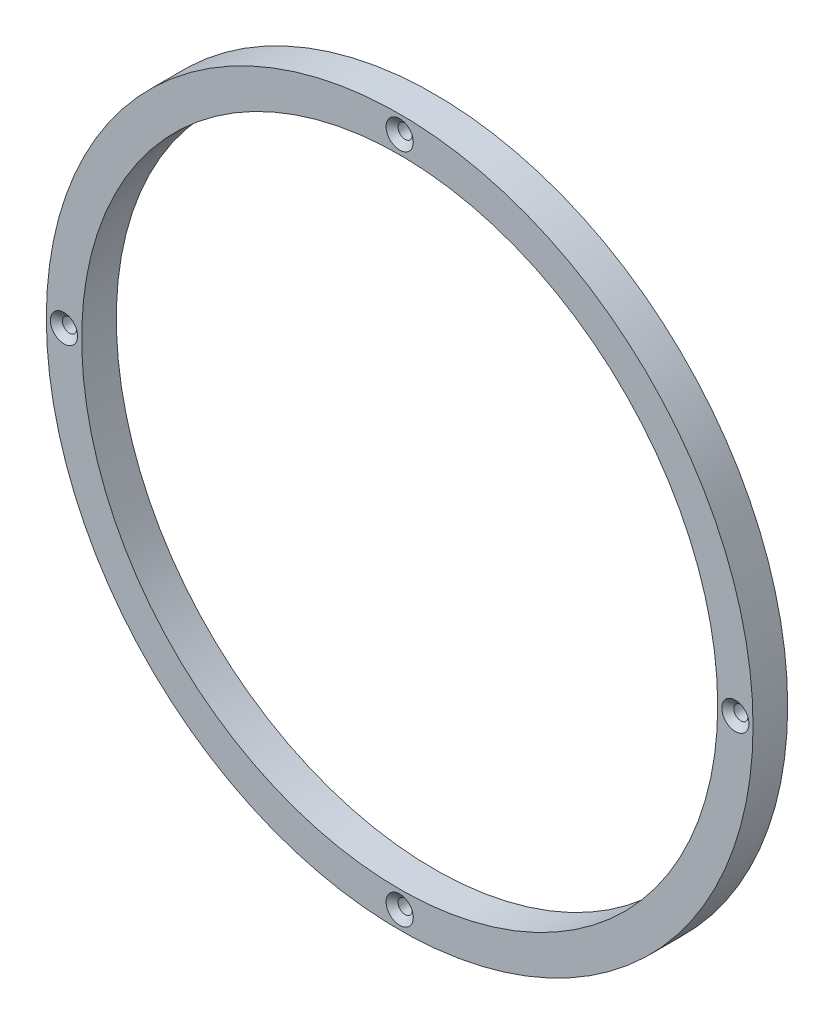
ISO-10303-21;
HEADER;
FILE_DESCRIPTION(('STEP AP214'),'2;1');
FILE_NAME('part.step','',(''),(''),'','','');
FILE_SCHEMA(('AUTOMOTIVE_DESIGN { 1 0 10303 214 1 1 1 1 }'));
ENDSEC;
DATA;
#1=APPLICATION_CONTEXT('core data for automotive mechanical design processes');
#2=APPLICATION_PROTOCOL_DEFINITION('international standard','automotive_design',2000,#1);
#3=PRODUCT_CONTEXT('',#1,'mechanical');
#4=PRODUCT('Part','Part','',(#3));
#5=PRODUCT_RELATED_PRODUCT_CATEGORY('part','',(#4));
#6=PRODUCT_DEFINITION_FORMATION('','',#4);
#7=PRODUCT_DEFINITION_CONTEXT('part definition',#1,'design');
#8=PRODUCT_DEFINITION('design','',#6,#7);
#9=PRODUCT_DEFINITION_SHAPE('','',#8);
#10=(LENGTH_UNIT() NAMED_UNIT(*) SI_UNIT(.MILLI.,.METRE.));
#11=(NAMED_UNIT(*) PLANE_ANGLE_UNIT() SI_UNIT($,.RADIAN.));
#12=(NAMED_UNIT(*) SI_UNIT($,.STERADIAN.) SOLID_ANGLE_UNIT());
#13=UNCERTAINTY_MEASURE_WITH_UNIT(LENGTH_MEASURE(1.E-05),#10,'distance_accuracy_value','');
#14=(GEOMETRIC_REPRESENTATION_CONTEXT(3) GLOBAL_UNCERTAINTY_ASSIGNED_CONTEXT((#13)) GLOBAL_UNIT_ASSIGNED_CONTEXT((#10,
#11,#12)) REPRESENTATION_CONTEXT('',''));
#15=CARTESIAN_POINT('',(0.,0.,0.));
#16=DIRECTION('',(0.,0.,1.));
#17=DIRECTION('',(1.,0.,0.));
#18=AXIS2_PLACEMENT_3D('',#15,#16,#17);
#19=CARTESIAN_POINT('',(0.,0.,12.446));
#20=DIRECTION('',(0.,0.,-1.));
#21=DIRECTION('',(-1.,0.,0.));
#22=AXIS2_PLACEMENT_3D('',#19,#20,#21);
#23=CYLINDRICAL_SURFACE('',#22,114.3);
#24=CARTESIAN_POINT('',(0.,0.,12.446));
#25=DIRECTION('',(0.,0.,1.));
#26=DIRECTION('',(1.,0.,0.));
#27=AXIS2_PLACEMENT_3D('',#24,#25,#26);
#28=CIRCLE('',#27,114.3);
#29=CARTESIAN_POINT('',(114.3,0.,12.446));
#30=VERTEX_POINT('',#29);
#31=EDGE_CURVE('E45',#30,#30,#28,.T.);
#32=ORIENTED_EDGE('',*,*,#31,.T.);
#33=EDGE_LOOP('',(#32));
#34=FACE_BOUND('',#33,.T.);
#35=CARTESIAN_POINT('',(0.,0.,0.));
#36=DIRECTION('',(0.,0.,1.));
#37=DIRECTION('',(1.,0.,0.));
#38=AXIS2_PLACEMENT_3D('',#35,#36,#37);
#39=CIRCLE('',#38,114.3);
#40=CARTESIAN_POINT('',(114.3,0.,0.));
#41=VERTEX_POINT('',#40);
#42=EDGE_CURVE('E53',#41,#41,#39,.T.);
#43=ORIENTED_EDGE('',*,*,#42,.F.);
#44=EDGE_LOOP('',(#43));
#45=FACE_BOUND('',#44,.T.);
#46=ADVANCED_FACE('F37',(#34,#45),#23,.F.);
#47=CARTESIAN_POINT('',(0.,0.,12.446));
#48=DIRECTION('',(0.,0.,-1.));
#49=DIRECTION('',(-1.,0.,0.));
#50=AXIS2_PLACEMENT_3D('',#47,#48,#49);
#51=CYLINDRICAL_SURFACE('',#50,127.);
#52=CARTESIAN_POINT('',(0.,0.,12.446));
#53=DIRECTION('',(0.,0.,1.));
#54=DIRECTION('',(1.,0.,0.));
#55=AXIS2_PLACEMENT_3D('',#52,#53,#54);
#56=CIRCLE('',#55,127.);
#57=CARTESIAN_POINT('',(127.,0.,12.446));
#58=VERTEX_POINT('',#57);
#59=EDGE_CURVE('E10',#58,#58,#56,.T.);
#60=ORIENTED_EDGE('',*,*,#59,.F.);
#61=EDGE_LOOP('',(#60));
#62=FACE_BOUND('',#61,.T.);
#63=CARTESIAN_POINT('',(0.,0.,0.));
#64=DIRECTION('',(0.,0.,1.));
#65=DIRECTION('',(1.,0.,0.));
#66=AXIS2_PLACEMENT_3D('',#63,#64,#65);
#67=CIRCLE('',#66,127.);
#68=CARTESIAN_POINT('',(127.,0.,0.));
#69=VERTEX_POINT('',#68);
#70=EDGE_CURVE('E40',#69,#69,#67,.T.);
#71=ORIENTED_EDGE('',*,*,#70,.T.);
#72=EDGE_LOOP('',(#71));
#73=FACE_BOUND('',#72,.T.);
#74=ADVANCED_FACE('F117',(#62,#73),#51,.T.);
#75=CARTESIAN_POINT('',(0.,0.,12.446));
#76=DIRECTION('',(0.,0.,1.));
#77=DIRECTION('',(1.,0.,0.));
#78=AXIS2_PLACEMENT_3D('',#75,#76,#77);
#79=PLANE('',#78);
#80=CARTESIAN_POINT('',(0.,-120.65,12.446));
#81=DIRECTION('',(0.,0.,1.));
#82=DIRECTION('',(1.,0.,0.));
#83=AXIS2_PLACEMENT_3D('',#80,#81,#82);
#84=CIRCLE('',#83,4.8895);
#85=CARTESIAN_POINT('',(4.8895,-120.65,12.446));
#86=VERTEX_POINT('',#85);
#87=EDGE_CURVE('E106',#86,#86,#84,.T.);
#88=ORIENTED_EDGE('',*,*,#87,.F.);
#89=EDGE_LOOP('',(#88));
#90=FACE_BOUND('',#89,.T.);
#91=CARTESIAN_POINT('',(-120.65,0.,12.446));
#92=DIRECTION('',(0.,0.,1.));
#93=DIRECTION('',(1.,0.,0.));
#94=AXIS2_PLACEMENT_3D('',#91,#92,#93);
#95=CIRCLE('',#94,4.88950000000001);
#96=CARTESIAN_POINT('',(-115.7605,0.,12.446));
#97=VERTEX_POINT('',#96);
#98=EDGE_CURVE('E94',#97,#97,#95,.T.);
#99=ORIENTED_EDGE('',*,*,#98,.F.);
#100=EDGE_LOOP('',(#99));
#101=FACE_BOUND('',#100,.T.);
#102=CARTESIAN_POINT('',(0.,120.65,12.446));
#103=DIRECTION('',(0.,0.,1.));
#104=DIRECTION('',(1.,0.,0.));
#105=AXIS2_PLACEMENT_3D('',#102,#103,#104);
#106=CIRCLE('',#105,4.8895);
#107=CARTESIAN_POINT('',(4.8895,120.65,12.446));
#108=VERTEX_POINT('',#107);
#109=EDGE_CURVE('E82',#108,#108,#106,.T.);
#110=ORIENTED_EDGE('',*,*,#109,.F.);
#111=EDGE_LOOP('',(#110));
#112=FACE_BOUND('',#111,.T.);
#113=CARTESIAN_POINT('',(120.65,0.,12.446));
#114=DIRECTION('',(0.,0.,1.));
#115=DIRECTION('',(1.,0.,0.));
#116=AXIS2_PLACEMENT_3D('',#113,#114,#115);
#117=CIRCLE('',#116,4.88949999999999);
#118=CARTESIAN_POINT('',(125.5395,0.,12.446));
#119=VERTEX_POINT('',#118);
#120=EDGE_CURVE('E68',#119,#119,#117,.T.);
#121=ORIENTED_EDGE('',*,*,#120,.F.);
#122=EDGE_LOOP('',(#121));
#123=FACE_BOUND('',#122,.T.);
#124=ORIENTED_EDGE('',*,*,#31,.F.);
#125=EDGE_LOOP('',(#124));
#126=FACE_BOUND('',#125,.T.);
#127=ORIENTED_EDGE('',*,*,#59,.T.);
#128=EDGE_LOOP('',(#127));
#129=FACE_BOUND('',#128,.T.);
#130=ADVANCED_FACE('F113',(#90,#101,#112,#123,#126,#129),#79,.T.);
#131=CARTESIAN_POINT('',(0.,0.,0.));
#132=DIRECTION('',(0.,0.,1.));
#133=DIRECTION('',(1.,0.,0.));
#134=AXIS2_PLACEMENT_3D('',#131,#132,#133);
#135=PLANE('',#134);
#136=CARTESIAN_POINT('',(0.,-120.65,0.));
#137=DIRECTION('',(0.,0.,1.));
#138=DIRECTION('',(1.,0.,0.));
#139=AXIS2_PLACEMENT_3D('',#136,#137,#138);
#140=CIRCLE('',#139,2.5527);
#141=CARTESIAN_POINT('',(2.5527,-120.65,0.));
#142=VERTEX_POINT('',#141);
#143=EDGE_CURVE('E98',#142,#142,#140,.T.);
#144=ORIENTED_EDGE('',*,*,#143,.T.);
#145=EDGE_LOOP('',(#144));
#146=FACE_BOUND('',#145,.T.);
#147=CARTESIAN_POINT('',(-120.65,0.,0.));
#148=DIRECTION('',(0.,0.,1.));
#149=DIRECTION('',(1.,0.,0.));
#150=AXIS2_PLACEMENT_3D('',#147,#148,#149);
#151=CIRCLE('',#150,2.55270000000001);
#152=CARTESIAN_POINT('',(-118.0973,0.,0.));
#153=VERTEX_POINT('',#152);
#154=EDGE_CURVE('E86',#153,#153,#151,.T.);
#155=ORIENTED_EDGE('',*,*,#154,.T.);
#156=EDGE_LOOP('',(#155));
#157=FACE_BOUND('',#156,.T.);
#158=CARTESIAN_POINT('',(0.,120.65,0.));
#159=DIRECTION('',(0.,0.,1.));
#160=DIRECTION('',(1.,0.,0.));
#161=AXIS2_PLACEMENT_3D('',#158,#159,#160);
#162=CIRCLE('',#161,2.5527);
#163=CARTESIAN_POINT('',(2.5527,120.65,0.));
#164=VERTEX_POINT('',#163);
#165=EDGE_CURVE('E74',#164,#164,#162,.T.);
#166=ORIENTED_EDGE('',*,*,#165,.T.);
#167=EDGE_LOOP('',(#166));
#168=FACE_BOUND('',#167,.T.);
#169=CARTESIAN_POINT('',(120.65,0.,0.));
#170=DIRECTION('',(0.,0.,1.));
#171=DIRECTION('',(1.,0.,0.));
#172=AXIS2_PLACEMENT_3D('',#169,#170,#171);
#173=CIRCLE('',#172,2.55270000000001);
#174=CARTESIAN_POINT('',(123.2027,0.,0.));
#175=VERTEX_POINT('',#174);
#176=EDGE_CURVE('E56',#175,#175,#173,.T.);
#177=ORIENTED_EDGE('',*,*,#176,.T.);
#178=EDGE_LOOP('',(#177));
#179=FACE_BOUND('',#178,.T.);
#180=ORIENTED_EDGE('',*,*,#42,.T.);
#181=EDGE_LOOP('',(#180));
#182=FACE_BOUND('',#181,.T.);
#183=ORIENTED_EDGE('',*,*,#70,.F.);
#184=EDGE_LOOP('',(#183));
#185=FACE_BOUND('',#184,.T.);
#186=ADVANCED_FACE('F116',(#146,#157,#168,#179,#182,#185),#135,.F.);
#187=CARTESIAN_POINT('',(120.65,0.,12.446));
#188=DIRECTION('',(0.,0.,1.));
#189=DIRECTION('',(1.,0.,0.));
#190=AXIS2_PLACEMENT_3D('',#187,#188,#189);
#191=CYLINDRICAL_SURFACE('',#190,2.5527);
#192=ORIENTED_EDGE('',*,*,#176,.F.);
#193=EDGE_LOOP('',(#192));
#194=FACE_BOUND('',#193,.T.);
#195=CARTESIAN_POINT('',(120.65,0.,10.4851919818649));
#196=DIRECTION('',(0.,0.,1.));
#197=DIRECTION('',(1.,0.,0.));
#198=AXIS2_PLACEMENT_3D('',#195,#196,#197);
#199=CIRCLE('',#198,2.55269999999999);
#200=CARTESIAN_POINT('',(123.2027,0.,10.4851919818649));
#201=VERTEX_POINT('',#200);
#202=EDGE_CURVE('E63',#201,#201,#199,.T.);
#203=ORIENTED_EDGE('',*,*,#202,.T.);
#204=EDGE_LOOP('',(#203));
#205=FACE_BOUND('',#204,.T.);
#206=ADVANCED_FACE('F138',(#194,#205),#191,.F.);
#207=CARTESIAN_POINT('',(120.65,0.,12.446));
#208=DIRECTION('',(0.,0.,1.));
#209=DIRECTION('',(1.,0.,0.));
#210=AXIS2_PLACEMENT_3D('',#207,#208,#209);
#211=CONICAL_SURFACE('',#210,4.88949999999999,0.872664625997164);
#212=ORIENTED_EDGE('',*,*,#202,.F.);
#213=EDGE_LOOP('',(#212));
#214=FACE_BOUND('',#213,.T.);
#215=ORIENTED_EDGE('',*,*,#120,.T.);
#216=EDGE_LOOP('',(#215));
#217=FACE_BOUND('',#216,.T.);
#218=ADVANCED_FACE('F143',(#214,#217),#211,.F.);
#219=CARTESIAN_POINT('',(0.,120.65,12.446));
#220=DIRECTION('',(0.,0.,1.));
#221=DIRECTION('',(1.,0.,0.));
#222=AXIS2_PLACEMENT_3D('',#219,#220,#221);
#223=CYLINDRICAL_SURFACE('',#222,2.55269999999999);
#224=ORIENTED_EDGE('',*,*,#165,.F.);
#225=EDGE_LOOP('',(#224));
#226=FACE_BOUND('',#225,.T.);
#227=CARTESIAN_POINT('',(0.,120.65,10.4851919818649));
#228=DIRECTION('',(0.,0.,1.));
#229=DIRECTION('',(1.,0.,0.));
#230=AXIS2_PLACEMENT_3D('',#227,#228,#229);
#231=CIRCLE('',#230,2.55269999999999);
#232=CARTESIAN_POINT('',(2.55269999999999,120.65,10.4851919818649));
#233=VERTEX_POINT('',#232);
#234=EDGE_CURVE('E78',#233,#233,#231,.T.);
#235=ORIENTED_EDGE('',*,*,#234,.T.);
#236=EDGE_LOOP('',(#235));
#237=FACE_BOUND('',#236,.T.);
#238=ADVANCED_FACE('F147',(#226,#237),#223,.F.);
#239=CARTESIAN_POINT('',(0.,120.65,12.446));
#240=DIRECTION('',(0.,0.,1.));
#241=DIRECTION('',(1.,0.,0.));
#242=AXIS2_PLACEMENT_3D('',#239,#240,#241);
#243=CONICAL_SURFACE('',#242,4.8895,0.872664625997166);
#244=ORIENTED_EDGE('',*,*,#234,.F.);
#245=EDGE_LOOP('',(#244));
#246=FACE_BOUND('',#245,.T.);
#247=ORIENTED_EDGE('',*,*,#109,.T.);
#248=EDGE_LOOP('',(#247));
#249=FACE_BOUND('',#248,.T.);
#250=ADVANCED_FACE('F151',(#246,#249),#243,.F.);
#251=CARTESIAN_POINT('',(-120.65,0.,12.446));
#252=DIRECTION('',(0.,0.,1.));
#253=DIRECTION('',(1.,0.,0.));
#254=AXIS2_PLACEMENT_3D('',#251,#252,#253);
#255=CYLINDRICAL_SURFACE('',#254,2.5527);
#256=ORIENTED_EDGE('',*,*,#154,.F.);
#257=EDGE_LOOP('',(#256));
#258=FACE_BOUND('',#257,.T.);
#259=CARTESIAN_POINT('',(-120.65,0.,10.4851919818649));
#260=DIRECTION('',(0.,0.,1.));
#261=DIRECTION('',(1.,0.,0.));
#262=AXIS2_PLACEMENT_3D('',#259,#260,#261);
#263=CIRCLE('',#262,2.55269999999999);
#264=CARTESIAN_POINT('',(-118.0973,0.,10.4851919818649));
#265=VERTEX_POINT('',#264);
#266=EDGE_CURVE('E90',#265,#265,#263,.T.);
#267=ORIENTED_EDGE('',*,*,#266,.T.);
#268=EDGE_LOOP('',(#267));
#269=FACE_BOUND('',#268,.T.);
#270=ADVANCED_FACE('F155',(#258,#269),#255,.F.);
#271=CARTESIAN_POINT('',(-120.65,0.,12.446));
#272=DIRECTION('',(0.,0.,1.));
#273=DIRECTION('',(1.,0.,0.));
#274=AXIS2_PLACEMENT_3D('',#271,#272,#273);
#275=CONICAL_SURFACE('',#274,4.88950000000001,0.872664625997166);
#276=ORIENTED_EDGE('',*,*,#266,.F.);
#277=EDGE_LOOP('',(#276));
#278=FACE_BOUND('',#277,.T.);
#279=ORIENTED_EDGE('',*,*,#98,.T.);
#280=EDGE_LOOP('',(#279));
#281=FACE_BOUND('',#280,.T.);
#282=ADVANCED_FACE('F159',(#278,#281),#275,.F.);
#283=CARTESIAN_POINT('',(0.,-120.65,12.446));
#284=DIRECTION('',(0.,0.,1.));
#285=DIRECTION('',(1.,0.,0.));
#286=AXIS2_PLACEMENT_3D('',#283,#284,#285);
#287=CYLINDRICAL_SURFACE('',#286,2.55269999999999);
#288=ORIENTED_EDGE('',*,*,#143,.F.);
#289=EDGE_LOOP('',(#288));
#290=FACE_BOUND('',#289,.T.);
#291=CARTESIAN_POINT('',(0.,-120.65,10.4851919818649));
#292=DIRECTION('',(0.,0.,1.));
#293=DIRECTION('',(1.,0.,0.));
#294=AXIS2_PLACEMENT_3D('',#291,#292,#293);
#295=CIRCLE('',#294,2.55269999999999);
#296=CARTESIAN_POINT('',(2.55269999999999,-120.65,10.4851919818649));
#297=VERTEX_POINT('',#296);
#298=EDGE_CURVE('E102',#297,#297,#295,.T.);
#299=ORIENTED_EDGE('',*,*,#298,.T.);
#300=EDGE_LOOP('',(#299));
#301=FACE_BOUND('',#300,.T.);
#302=ADVANCED_FACE('F163',(#290,#301),#287,.F.);
#303=CARTESIAN_POINT('',(0.,-120.65,12.446));
#304=DIRECTION('',(0.,0.,1.));
#305=DIRECTION('',(1.,0.,0.));
#306=AXIS2_PLACEMENT_3D('',#303,#304,#305);
#307=CONICAL_SURFACE('',#306,4.8895,0.872664625997166);
#308=ORIENTED_EDGE('',*,*,#298,.F.);
#309=EDGE_LOOP('',(#308));
#310=FACE_BOUND('',#309,.T.);
#311=ORIENTED_EDGE('',*,*,#87,.T.);
#312=EDGE_LOOP('',(#311));
#313=FACE_BOUND('',#312,.T.);
#314=ADVANCED_FACE('F111',(#310,#313),#307,.F.);
#315=CLOSED_SHELL('',(#46,#74,#130,#186,#206,#218,#238,#250,#270,#282,#302,#314));
#316=MANIFOLD_SOLID_BREP('B2',#315);
#317=ADVANCED_BREP_SHAPE_REPRESENTATION('',(#18,#316),#14);
#318=SHAPE_DEFINITION_REPRESENTATION(#9,#317);
ENDSEC;
END-ISO-10303-21;
